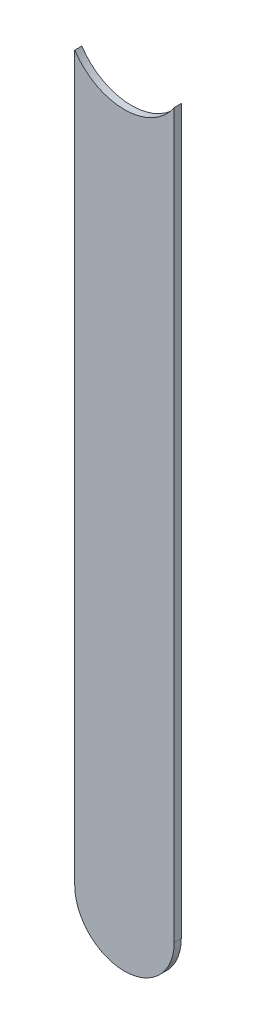
ISO-10303-21;
HEADER;
FILE_DESCRIPTION(('STEP AP214'),'2;1');
FILE_NAME('part.step','',(''),(''),'','','');
FILE_SCHEMA(('AUTOMOTIVE_DESIGN { 1 0 10303 214 1 1 1 1 }'));
ENDSEC;
DATA;
#1=APPLICATION_CONTEXT('core data for automotive mechanical design processes');
#2=APPLICATION_PROTOCOL_DEFINITION('international standard','automotive_design',2000,#1);
#3=PRODUCT_CONTEXT('',#1,'mechanical');
#4=PRODUCT('Part','Part','',(#3));
#5=PRODUCT_RELATED_PRODUCT_CATEGORY('part','',(#4));
#6=PRODUCT_DEFINITION_FORMATION('','',#4);
#7=PRODUCT_DEFINITION_CONTEXT('part definition',#1,'design');
#8=PRODUCT_DEFINITION('design','',#6,#7);
#9=PRODUCT_DEFINITION_SHAPE('','',#8);
#10=(LENGTH_UNIT() NAMED_UNIT(*) SI_UNIT(.MILLI.,.METRE.));
#11=(NAMED_UNIT(*) PLANE_ANGLE_UNIT() SI_UNIT($,.RADIAN.));
#12=(NAMED_UNIT(*) SI_UNIT($,.STERADIAN.) SOLID_ANGLE_UNIT());
#13=UNCERTAINTY_MEASURE_WITH_UNIT(LENGTH_MEASURE(1.E-05),#10,'distance_accuracy_value','');
#14=(GEOMETRIC_REPRESENTATION_CONTEXT(3) GLOBAL_UNCERTAINTY_ASSIGNED_CONTEXT((#13)) GLOBAL_UNIT_ASSIGNED_CONTEXT((#10,
#11,#12)) REPRESENTATION_CONTEXT('',''));
#15=CARTESIAN_POINT('',(0.,0.,0.));
#16=DIRECTION('',(0.,0.,1.));
#17=DIRECTION('',(1.,0.,0.));
#18=AXIS2_PLACEMENT_3D('',#15,#16,#17);
#19=CARTESIAN_POINT('',(78.6499951,84.2000348,0.));
#20=DIRECTION('',(-1.,0.,0.));
#21=DIRECTION('',(0.,1.,0.));
#22=AXIS2_PLACEMENT_3D('',#19,#20,#21);
#23=PLANE('',#22);
#24=DIRECTION('',(0.,1.,0.));
#25=VECTOR('',#24,1.);
#26=CARTESIAN_POINT('',(78.6499951,84.2000348,0.03556));
#27=LINE('',#26,#25);
#28=CARTESIAN_POINT('',(78.6499951,84.2000348,0.03556));
#29=VERTEX_POINT('',#28);
#30=CARTESIAN_POINT('',(78.6499951,87.8341454921447,0.03556));
#31=VERTEX_POINT('',#30);
#32=EDGE_CURVE('E11',#29,#31,#27,.T.);
#33=ORIENTED_EDGE('',*,*,#32,.F.);
#34=DIRECTION('',(0.,0.,1.));
#35=VECTOR('',#34,1.);
#36=CARTESIAN_POINT('',(78.6499951,84.2000348,0.));
#37=LINE('',#36,#35);
#38=CARTESIAN_POINT('',(78.6499951,84.2000348,0.));
#39=VERTEX_POINT('',#38);
#40=EDGE_CURVE('E24',#39,#29,#37,.T.);
#41=ORIENTED_EDGE('',*,*,#40,.F.);
#42=DIRECTION('',(0.,1.,0.));
#43=VECTOR('',#42,1.);
#44=CARTESIAN_POINT('',(78.6499951,84.2000348,0.));
#45=LINE('',#44,#43);
#46=CARTESIAN_POINT('',(78.6499951,87.8341454921447,0.));
#47=VERTEX_POINT('',#46);
#48=EDGE_CURVE('E75',#39,#47,#45,.T.);
#49=ORIENTED_EDGE('',*,*,#48,.T.);
#50=DIRECTION('',(0.,0.,1.));
#51=VECTOR('',#50,1.);
#52=CARTESIAN_POINT('',(78.6499951,87.8341454921447,0.));
#53=LINE('',#52,#51);
#54=EDGE_CURVE('E37',#47,#31,#53,.T.);
#55=ORIENTED_EDGE('',*,*,#54,.T.);
#56=EDGE_LOOP('',(#33,#41,#49,#55));
#57=FACE_BOUND('',#56,.T.);
#58=ADVANCED_FACE('F17',(#57),#23,.F.);
#59=CARTESIAN_POINT('',(78.3999956,87.9999764,0.));
#60=DIRECTION('',(0.,0.,-1.));
#61=DIRECTION('',(1.,0.,0.));
#62=AXIS2_PLACEMENT_3D('',#59,#60,#61);
#63=CYLINDRICAL_SURFACE('',#62,0.2999994);
#64=DIRECTION('',(0.,0.,1.));
#65=VECTOR('',#64,1.);
#66=CARTESIAN_POINT('',(78.1499961,87.8341454921447,0.));
#67=LINE('',#66,#65);
#68=CARTESIAN_POINT('',(78.1499961,87.8341454921447,0.));
#69=VERTEX_POINT('',#68);
#70=CARTESIAN_POINT('',(78.1499961,87.8341454921447,0.03556));
#71=VERTEX_POINT('',#70);
#72=EDGE_CURVE('E67',#69,#71,#67,.T.);
#73=ORIENTED_EDGE('',*,*,#72,.T.);
#74=CARTESIAN_POINT('',(78.3999956,87.9999764,0.03556));
#75=DIRECTION('',(0.,0.,1.));
#76=DIRECTION('',(1.,0.,0.));
#77=AXIS2_PLACEMENT_3D('',#74,#75,#76);
#78=CIRCLE('',#77,0.2999994);
#79=EDGE_CURVE('E82',#71,#31,#78,.T.);
#80=ORIENTED_EDGE('',*,*,#79,.T.);
#81=ORIENTED_EDGE('',*,*,#54,.F.);
#82=CARTESIAN_POINT('',(78.3999956,87.9999764,0.));
#83=DIRECTION('',(0.,0.,1.));
#84=DIRECTION('',(1.,0.,0.));
#85=AXIS2_PLACEMENT_3D('',#82,#83,#84);
#86=CIRCLE('',#85,0.2999994);
#87=EDGE_CURVE('E80',#69,#47,#86,.T.);
#88=ORIENTED_EDGE('',*,*,#87,.F.);
#89=EDGE_LOOP('',(#73,#80,#81,#88));
#90=FACE_BOUND('',#89,.T.);
#91=ADVANCED_FACE('F88',(#90),#63,.F.);
#92=CARTESIAN_POINT('',(78.1499961,87.8341454921447,0.));
#93=DIRECTION('',(1.,0.,0.));
#94=DIRECTION('',(0.,-1.,0.));
#95=AXIS2_PLACEMENT_3D('',#92,#93,#94);
#96=PLANE('',#95);
#97=DIRECTION('',(0.,-1.,0.));
#98=VECTOR('',#97,1.);
#99=CARTESIAN_POINT('',(78.1499961,87.9999764,0.03556));
#100=LINE('',#99,#98);
#101=CARTESIAN_POINT('',(78.1499961,84.2000348,0.03556));
#102=VERTEX_POINT('',#101);
#103=EDGE_CURVE('E71',#71,#102,#100,.T.);
#104=ORIENTED_EDGE('',*,*,#103,.F.);
#105=ORIENTED_EDGE('',*,*,#72,.F.);
#106=DIRECTION('',(0.,-1.,0.));
#107=VECTOR('',#106,1.);
#108=CARTESIAN_POINT('',(78.1499961,87.9999764,0.));
#109=LINE('',#108,#107);
#110=CARTESIAN_POINT('',(78.1499961,84.2000348,0.));
#111=VERTEX_POINT('',#110);
#112=EDGE_CURVE('E63',#69,#111,#109,.T.);
#113=ORIENTED_EDGE('',*,*,#112,.T.);
#114=DIRECTION('',(0.,0.,1.));
#115=VECTOR('',#114,1.);
#116=CARTESIAN_POINT('',(78.1499961,84.2000348,0.));
#117=LINE('',#116,#115);
#118=EDGE_CURVE('E53',#111,#102,#117,.T.);
#119=ORIENTED_EDGE('',*,*,#118,.T.);
#120=EDGE_LOOP('',(#104,#105,#113,#119));
#121=FACE_BOUND('',#120,.T.);
#122=ADVANCED_FACE('F66',(#121),#96,.F.);
#123=CARTESIAN_POINT('',(78.3999956,84.2000348,0.));
#124=DIRECTION('',(0.,0.,-1.));
#125=DIRECTION('',(-1.,0.,0.));
#126=AXIS2_PLACEMENT_3D('',#123,#124,#125);
#127=CYLINDRICAL_SURFACE('',#126,0.249999500000001);
#128=CARTESIAN_POINT('',(78.3999956,84.2000348,0.03556));
#129=DIRECTION('',(0.,0.,1.));
#130=DIRECTION('',(-1.,0.,0.));
#131=AXIS2_PLACEMENT_3D('',#128,#129,#130);
#132=CIRCLE('',#131,0.249999500000001);
#133=EDGE_CURVE('E59',#102,#29,#132,.T.);
#134=ORIENTED_EDGE('',*,*,#133,.F.);
#135=ORIENTED_EDGE('',*,*,#118,.F.);
#136=CARTESIAN_POINT('',(78.3999956,84.2000348,0.));
#137=DIRECTION('',(0.,0.,1.));
#138=DIRECTION('',(-1.,0.,0.));
#139=AXIS2_PLACEMENT_3D('',#136,#137,#138);
#140=CIRCLE('',#139,0.249999500000001);
#141=EDGE_CURVE('E57',#111,#39,#140,.T.);
#142=ORIENTED_EDGE('',*,*,#141,.T.);
#143=ORIENTED_EDGE('',*,*,#40,.T.);
#144=EDGE_LOOP('',(#134,#135,#142,#143));
#145=FACE_BOUND('',#144,.T.);
#146=ADVANCED_FACE('F55',(#145),#127,.T.);
#147=CARTESIAN_POINT('',(78.6499951,84.2000348,0.));
#148=DIRECTION('',(0.,0.,-1.));
#149=DIRECTION('',(-1.,0.,0.));
#150=AXIS2_PLACEMENT_3D('',#147,#148,#149);
#151=PLANE('',#150);
#152=ORIENTED_EDGE('',*,*,#48,.F.);
#153=ORIENTED_EDGE('',*,*,#141,.F.);
#154=ORIENTED_EDGE('',*,*,#112,.F.);
#155=ORIENTED_EDGE('',*,*,#87,.T.);
#156=EDGE_LOOP('',(#152,#153,#154,#155));
#157=FACE_BOUND('',#156,.T.);
#158=ADVANCED_FACE('F74',(#157),#151,.T.);
#159=CARTESIAN_POINT('',(78.6499951,84.2000348,0.03556));
#160=DIRECTION('',(0.,0.,-1.));
#161=DIRECTION('',(-1.,0.,0.));
#162=AXIS2_PLACEMENT_3D('',#159,#160,#161);
#163=PLANE('',#162);
#164=ORIENTED_EDGE('',*,*,#133,.T.);
#165=ORIENTED_EDGE('',*,*,#32,.T.);
#166=ORIENTED_EDGE('',*,*,#79,.F.);
#167=ORIENTED_EDGE('',*,*,#103,.T.);
#168=EDGE_LOOP('',(#164,#165,#166,#167));
#169=FACE_BOUND('',#168,.T.);
#170=ADVANCED_FACE('F91',(#169),#163,.F.);
#171=CLOSED_SHELL('',(#58,#91,#122,#146,#158,#170));
#172=MANIFOLD_SOLID_BREP('B1',#171);
#173=ADVANCED_BREP_SHAPE_REPRESENTATION('',(#18,#172),#14);
#174=SHAPE_DEFINITION_REPRESENTATION(#9,#173);
ENDSEC;
END-ISO-10303-21;
